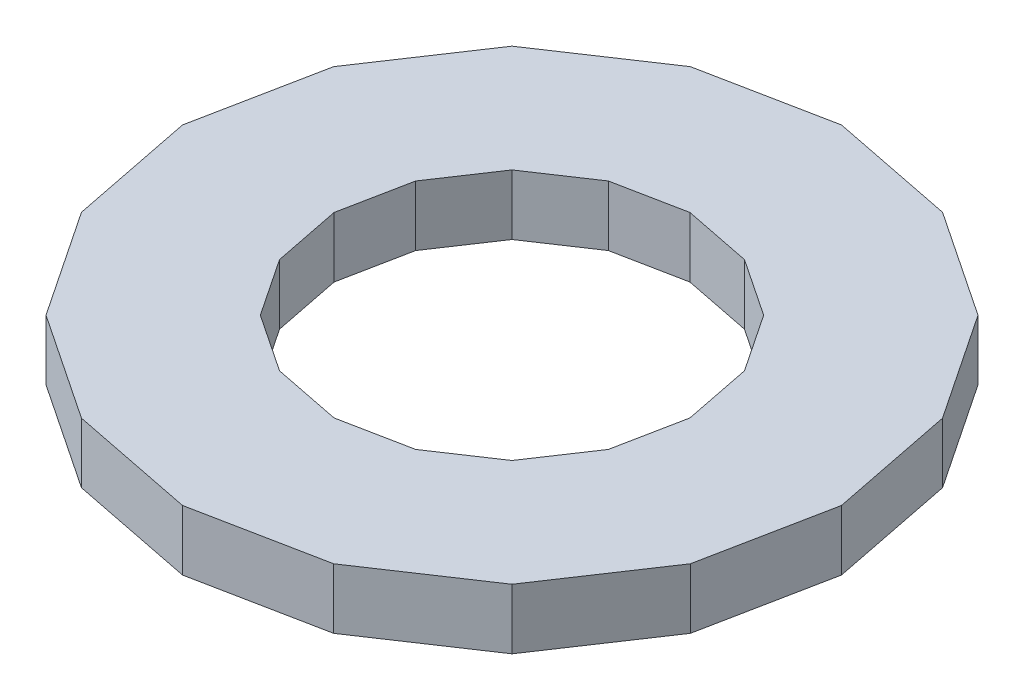
ISO-10303-21;
HEADER;
FILE_DESCRIPTION(('STEP AP214'),'2;1');
FILE_NAME('part.step','',(''),(''),'','','');
FILE_SCHEMA(('AUTOMOTIVE_DESIGN { 1 0 10303 214 1 1 1 1 }'));
ENDSEC;
DATA;
#1=APPLICATION_CONTEXT('core data for automotive mechanical design processes');
#2=APPLICATION_PROTOCOL_DEFINITION('international standard','automotive_design',2000,#1);
#3=PRODUCT_CONTEXT('',#1,'mechanical');
#4=PRODUCT('Part','Part','',(#3));
#5=PRODUCT_RELATED_PRODUCT_CATEGORY('part','',(#4));
#6=PRODUCT_DEFINITION_FORMATION('','',#4);
#7=PRODUCT_DEFINITION_CONTEXT('part definition',#1,'design');
#8=PRODUCT_DEFINITION('design','',#6,#7);
#9=PRODUCT_DEFINITION_SHAPE('','',#8);
#10=(LENGTH_UNIT() NAMED_UNIT(*) SI_UNIT(.MILLI.,.METRE.));
#11=(NAMED_UNIT(*) PLANE_ANGLE_UNIT() SI_UNIT($,.RADIAN.));
#12=(NAMED_UNIT(*) SI_UNIT($,.STERADIAN.) SOLID_ANGLE_UNIT());
#13=UNCERTAINTY_MEASURE_WITH_UNIT(LENGTH_MEASURE(1.E-05),#10,'distance_accuracy_value','');
#14=(GEOMETRIC_REPRESENTATION_CONTEXT(3) GLOBAL_UNCERTAINTY_ASSIGNED_CONTEXT((#13)) GLOBAL_UNIT_ASSIGNED_CONTEXT((#10,
#11,#12)) REPRESENTATION_CONTEXT('',''));
#15=CARTESIAN_POINT('',(0.,0.,0.));
#16=DIRECTION('',(0.,0.,1.));
#17=DIRECTION('',(1.,0.,0.));
#18=AXIS2_PLACEMENT_3D('',#15,#16,#17);
#19=CARTESIAN_POINT('',(0.,19.05,0.));
#20=DIRECTION('',(0.,1.,0.));
#21=DIRECTION('',(0.,0.,1.));
#22=AXIS2_PLACEMENT_3D('',#19,#20,#21);
#23=PLANE('',#22);
#24=DIRECTION('',(0.195090322016117,0.,-0.980785280403233));
#25=VECTOR('',#24,1.);
#26=CARTESIAN_POINT('',(96.2284131094798,19.05,39.8591137955862));
#27=LINE('',#26,#25);
#28=CARTESIAN_POINT('',(96.2284131094798,19.05,39.8591137955862));
#29=VERTEX_POINT('',#28);
#30=CARTESIAN_POINT('',(104.156883796215,19.05,-1.13797643195644E-12));
#31=VERTEX_POINT('',#30);
#32=EDGE_CURVE('E370',#29,#31,#27,.T.);
#33=ORIENTED_EDGE('',*,*,#32,.T.);
#34=DIRECTION('',(-0.195090322016139,0.,-0.980785280403228));
#35=VECTOR('',#34,1.);
#36=CARTESIAN_POINT('',(104.156883796215,19.05,-1.13797643195644E-12));
#37=LINE('',#36,#35);
#38=CARTESIAN_POINT('',(96.2284131094789,19.05,-39.8591137955883));
#39=VERTEX_POINT('',#38);
#40=EDGE_CURVE('E373',#31,#39,#37,.T.);
#41=ORIENTED_EDGE('',*,*,#40,.T.);
#42=DIRECTION('',(-0.555570233019612,0.,-0.831469612302539));
#43=VECTOR('',#42,1.);
#44=CARTESIAN_POINT('',(96.2284131094789,19.05,-39.8591137955883));
#45=LINE('',#44,#43);
#46=CARTESIAN_POINT('',(73.6500388395619,19.05,-73.6500388395636));
#47=VERTEX_POINT('',#46);
#48=EDGE_CURVE('E376',#39,#47,#45,.T.);
#49=ORIENTED_EDGE('',*,*,#48,.T.);
#50=DIRECTION('',(-0.831469612302551,0.,-0.555570233019593));
#51=VECTOR('',#50,1.);
#52=CARTESIAN_POINT('',(73.6500388395619,19.05,-73.6500388395636));
#53=LINE('',#52,#51);
#54=CARTESIAN_POINT('',(39.8591137955863,19.05,-96.2284131094797));
#55=VERTEX_POINT('',#54);
#56=EDGE_CURVE('E379',#47,#55,#53,.T.);
#57=ORIENTED_EDGE('',*,*,#56,.T.);
#58=DIRECTION('',(-0.980785280403233,0.,-0.195090322016117));
#59=VECTOR('',#58,1.);
#60=CARTESIAN_POINT('',(39.8591137955863,19.05,-96.2284131094797));
#61=LINE('',#60,#59);
#62=CARTESIAN_POINT('',(-1.12392690365503E-12,19.05,-104.156883796215));
#63=VERTEX_POINT('',#62);
#64=EDGE_CURVE('E381',#55,#63,#61,.T.);
#65=ORIENTED_EDGE('',*,*,#64,.T.);
#66=DIRECTION('',(-0.980785280403228,0.,0.195090322016139));
#67=VECTOR('',#66,1.);
#68=CARTESIAN_POINT('',(-1.12392690365503E-12,19.05,-104.156883796215));
#69=LINE('',#68,#67);
#70=CARTESIAN_POINT('',(-39.8591137955883,19.05,-96.2284131094789));
#71=VERTEX_POINT('',#70);
#72=EDGE_CURVE('E383',#63,#71,#69,.T.);
#73=ORIENTED_EDGE('',*,*,#72,.T.);
#74=DIRECTION('',(-0.831469612302539,0.,0.555570233019612));
#75=VECTOR('',#74,1.);
#76=CARTESIAN_POINT('',(-39.8591137955883,19.05,-96.2284131094789));
#77=LINE('',#76,#75);
#78=CARTESIAN_POINT('',(-73.6500388395635,19.05,-73.6500388395619));
#79=VERTEX_POINT('',#78);
#80=EDGE_CURVE('E385',#71,#79,#77,.T.);
#81=ORIENTED_EDGE('',*,*,#80,.T.);
#82=DIRECTION('',(-0.555570233019593,0.,0.831469612302552));
#83=VECTOR('',#82,1.);
#84=CARTESIAN_POINT('',(-73.6500388395635,19.05,-73.6500388395619));
#85=LINE('',#84,#83);
#86=CARTESIAN_POINT('',(-96.2284131094798,19.05,-39.8591137955861));
#87=VERTEX_POINT('',#86);
#88=EDGE_CURVE('E387',#79,#87,#85,.T.);
#89=ORIENTED_EDGE('',*,*,#88,.T.);
#90=DIRECTION('',(-0.195090322016118,0.,0.980785280403233));
#91=VECTOR('',#90,1.);
#92=CARTESIAN_POINT('',(-96.2284131094798,19.05,-39.8591137955861));
#93=LINE('',#92,#91);
#94=CARTESIAN_POINT('',(-104.156883796215,19.05,1.17280698412532E-12));
#95=VERTEX_POINT('',#94);
#96=EDGE_CURVE('E389',#87,#95,#93,.T.);
#97=ORIENTED_EDGE('',*,*,#96,.T.);
#98=DIRECTION('',(0.195090322016139,0.,0.980785280403228));
#99=VECTOR('',#98,1.);
#100=CARTESIAN_POINT('',(-104.156883796215,19.05,1.17280698412532E-12));
#101=LINE('',#100,#99);
#102=CARTESIAN_POINT('',(-96.2284131094789,19.05,39.8591137955883));
#103=VERTEX_POINT('',#102);
#104=EDGE_CURVE('E391',#95,#103,#101,.T.);
#105=ORIENTED_EDGE('',*,*,#104,.T.);
#106=DIRECTION('',(0.555570233019611,0.,0.831469612302539));
#107=VECTOR('',#106,1.);
#108=CARTESIAN_POINT('',(-96.2284131094789,19.05,39.8591137955883));
#109=LINE('',#108,#107);
#110=CARTESIAN_POINT('',(-73.6500388395619,19.05,73.6500388395635));
#111=VERTEX_POINT('',#110);
#112=EDGE_CURVE('E393',#103,#111,#109,.T.);
#113=ORIENTED_EDGE('',*,*,#112,.T.);
#114=DIRECTION('',(0.831469612302552,0.,0.555570233019593));
#115=VECTOR('',#114,1.);
#116=CARTESIAN_POINT('',(-73.6500388395619,19.05,73.6500388395635));
#117=LINE('',#116,#115);
#118=CARTESIAN_POINT('',(-39.8591137955862,19.05,96.2284131094798));
#119=VERTEX_POINT('',#118);
#120=EDGE_CURVE('E395',#111,#119,#117,.T.);
#121=ORIENTED_EDGE('',*,*,#120,.T.);
#122=DIRECTION('',(0.980785280403233,0.,0.195090322016118));
#123=VECTOR('',#122,1.);
#124=CARTESIAN_POINT('',(-39.8591137955862,19.05,96.2284131094798));
#125=LINE('',#124,#123);
#126=CARTESIAN_POINT('',(1.1188155577576E-12,19.05,104.156883796215));
#127=VERTEX_POINT('',#126);
#128=EDGE_CURVE('E397',#119,#127,#125,.T.);
#129=ORIENTED_EDGE('',*,*,#128,.T.);
#130=DIRECTION('',(0.980785280403228,0.,-0.195090322016139));
#131=VECTOR('',#130,1.);
#132=CARTESIAN_POINT('',(1.1188155577576E-12,19.05,104.156883796215));
#133=LINE('',#132,#131);
#134=CARTESIAN_POINT('',(39.8591137955884,19.05,96.2284131094789));
#135=VERTEX_POINT('',#134);
#136=EDGE_CURVE('E399',#127,#135,#133,.T.);
#137=ORIENTED_EDGE('',*,*,#136,.T.);
#138=DIRECTION('',(0.831469612302539,0.,-0.555570233019612));
#139=VECTOR('',#138,1.);
#140=CARTESIAN_POINT('',(39.8591137955884,19.05,96.2284131094789));
#141=LINE('',#140,#139);
#142=CARTESIAN_POINT('',(73.6500388395635,19.05,73.6500388395619));
#143=VERTEX_POINT('',#142);
#144=EDGE_CURVE('E401',#135,#143,#141,.T.);
#145=ORIENTED_EDGE('',*,*,#144,.T.);
#146=DIRECTION('',(0.555570233019593,0.,-0.831469612302551));
#147=VECTOR('',#146,1.);
#148=CARTESIAN_POINT('',(73.6500388395635,19.05,73.6500388395619));
#149=LINE('',#148,#147);
#150=EDGE_CURVE('E403',#143,#29,#149,.T.);
#151=ORIENTED_EDGE('',*,*,#150,.T.);
#152=EDGE_LOOP('',(#33,#41,#49,#57,#65,#73,#81,#89,#97,#105,#113,#121,#129,#137,#145,#151));
#153=FACE_BOUND('',#152,.T.);
#154=DIRECTION('',(-0.195090322016139,0.,-0.980785280403228));
#155=VECTOR('',#154,1.);
#156=CARTESIAN_POINT('',(56.2462952720059,19.05,-6.4166277362856E-13));
#157=LINE('',#156,#155);
#158=CARTESIAN_POINT('',(56.2462952720059,19.05,-6.4166277362856E-13));
#159=VERTEX_POINT('',#158);
#160=CARTESIAN_POINT('',(51.9648009813924,19.05,-21.5245253325121));
#161=VERTEX_POINT('',#160);
#162=EDGE_CURVE('E252',#159,#161,#157,.T.);
#163=ORIENTED_EDGE('',*,*,#162,.F.);
#164=DIRECTION('',(0.195090322016117,0.,-0.980785280403233));
#165=VECTOR('',#164,1.);
#166=CARTESIAN_POINT('',(51.9648009813929,19.05,21.524525332511));
#167=LINE('',#166,#165);
#168=CARTESIAN_POINT('',(51.9648009813929,19.05,21.524525332511));
#169=VERTEX_POINT('',#168);
#170=EDGE_CURVE('E244',#169,#159,#167,.T.);
#171=ORIENTED_EDGE('',*,*,#170,.F.);
#172=DIRECTION('',(0.555570233019593,0.,-0.831469612302552));
#173=VECTOR('',#172,1.);
#174=CARTESIAN_POINT('',(39.7721368034567,19.05,39.7721368034558));
#175=LINE('',#174,#173);
#176=CARTESIAN_POINT('',(39.7721368034567,19.05,39.7721368034558));
#177=VERTEX_POINT('',#176);
#178=EDGE_CURVE('E297',#177,#169,#175,.T.);
#179=ORIENTED_EDGE('',*,*,#178,.F.);
#180=DIRECTION('',(0.831469612302539,0.,-0.555570233019611));
#181=VECTOR('',#180,1.);
#182=CARTESIAN_POINT('',(21.5245253325122,19.05,51.9648009813924));
#183=LINE('',#182,#181);
#184=CARTESIAN_POINT('',(21.5245253325122,19.05,51.9648009813924));
#185=VERTEX_POINT('',#184);
#186=EDGE_CURVE('E295',#185,#177,#183,.T.);
#187=ORIENTED_EDGE('',*,*,#186,.F.);
#188=DIRECTION('',(0.980785280403228,0.,-0.195090322016139));
#189=VECTOR('',#188,1.);
#190=CARTESIAN_POINT('',(6.52791289658775E-13,19.05,56.2462952720059));
#191=LINE('',#190,#189);
#192=CARTESIAN_POINT('',(6.52791289658775E-13,19.05,56.2462952720059));
#193=VERTEX_POINT('',#192);
#194=EDGE_CURVE('E293',#193,#185,#191,.T.);
#195=ORIENTED_EDGE('',*,*,#194,.F.);
#196=DIRECTION('',(0.980785280403233,0.,0.195090322016118));
#197=VECTOR('',#196,1.);
#198=CARTESIAN_POINT('',(-21.5245253325109,19.05,51.9648009813929));
#199=LINE('',#198,#197);
#200=CARTESIAN_POINT('',(-21.5245253325109,19.05,51.9648009813929));
#201=VERTEX_POINT('',#200);
#202=EDGE_CURVE('E291',#201,#193,#199,.T.);
#203=ORIENTED_EDGE('',*,*,#202,.F.);
#204=DIRECTION('',(0.831469612302551,0.,0.555570233019593));
#205=VECTOR('',#204,1.);
#206=CARTESIAN_POINT('',(-39.7721368034558,19.05,39.7721368034567));
#207=LINE('',#206,#205);
#208=CARTESIAN_POINT('',(-39.7721368034558,19.05,39.7721368034567));
#209=VERTEX_POINT('',#208);
#210=EDGE_CURVE('E289',#209,#201,#207,.T.);
#211=ORIENTED_EDGE('',*,*,#210,.F.);
#212=DIRECTION('',(0.555570233019611,0.,0.831469612302539));
#213=VECTOR('',#212,1.);
#214=CARTESIAN_POINT('',(-51.9648009813924,19.05,21.5245253325121));
#215=LINE('',#214,#213);
#216=CARTESIAN_POINT('',(-51.9648009813924,19.05,21.5245253325121));
#217=VERTEX_POINT('',#216);
#218=EDGE_CURVE('E287',#217,#209,#215,.T.);
#219=ORIENTED_EDGE('',*,*,#218,.F.);
#220=DIRECTION('',(0.195090322016139,0.,0.980785280403228));
#221=VECTOR('',#220,1.);
#222=CARTESIAN_POINT('',(-56.2462952720059,19.05,6.347391871939E-13));
#223=LINE('',#222,#221);
#224=CARTESIAN_POINT('',(-56.2462952720059,19.05,6.347391871939E-13));
#225=VERTEX_POINT('',#224);
#226=EDGE_CURVE('E285',#225,#217,#223,.T.);
#227=ORIENTED_EDGE('',*,*,#226,.F.);
#228=DIRECTION('',(-0.195090322016117,0.,0.980785280403233));
#229=VECTOR('',#228,1.);
#230=CARTESIAN_POINT('',(-51.9648009813928,19.05,-21.5245253325109));
#231=LINE('',#230,#229);
#232=CARTESIAN_POINT('',(-51.9648009813928,19.05,-21.5245253325109));
#233=VERTEX_POINT('',#232);
#234=EDGE_CURVE('E283',#233,#225,#231,.T.);
#235=ORIENTED_EDGE('',*,*,#234,.F.);
#236=DIRECTION('',(-0.555570233019593,0.,0.831469612302552));
#237=VECTOR('',#236,1.);
#238=CARTESIAN_POINT('',(-39.7721368034567,19.05,-39.7721368034558));
#239=LINE('',#238,#237);
#240=CARTESIAN_POINT('',(-39.7721368034567,19.05,-39.7721368034558));
#241=VERTEX_POINT('',#240);
#242=EDGE_CURVE('E281',#241,#233,#239,.T.);
#243=ORIENTED_EDGE('',*,*,#242,.F.);
#244=DIRECTION('',(-0.831469612302539,0.,0.555570233019612));
#245=VECTOR('',#244,1.);
#246=CARTESIAN_POINT('',(-21.5245253325121,19.05,-51.9648009813924));
#247=LINE('',#246,#245);
#248=CARTESIAN_POINT('',(-21.5245253325121,19.05,-51.9648009813924));
#249=VERTEX_POINT('',#248);
#250=EDGE_CURVE('E279',#249,#241,#247,.T.);
#251=ORIENTED_EDGE('',*,*,#250,.F.);
#252=DIRECTION('',(-0.980785280403228,0.,0.195090322016139));
#253=VECTOR('',#252,1.);
#254=CARTESIAN_POINT('',(-6.62740420630265E-13,19.05,-56.2462952720059));
#255=LINE('',#254,#253);
#256=CARTESIAN_POINT('',(-6.62740420630265E-13,19.05,-56.2462952720059));
#257=VERTEX_POINT('',#256);
#258=EDGE_CURVE('E277',#257,#249,#255,.T.);
#259=ORIENTED_EDGE('',*,*,#258,.F.);
#260=DIRECTION('',(-0.980785280403233,0.,-0.195090322016117));
#261=VECTOR('',#260,1.);
#262=CARTESIAN_POINT('',(21.5245253325111,19.05,-51.9648009813928));
#263=LINE('',#262,#261);
#264=CARTESIAN_POINT('',(21.5245253325111,19.05,-51.9648009813928));
#265=VERTEX_POINT('',#264);
#266=EDGE_CURVE('E275',#265,#257,#263,.T.);
#267=ORIENTED_EDGE('',*,*,#266,.F.);
#268=DIRECTION('',(-0.831469612302552,0.,-0.555570233019593));
#269=VECTOR('',#268,1.);
#270=CARTESIAN_POINT('',(39.7721368034558,19.05,-39.7721368034567));
#271=LINE('',#270,#269);
#272=CARTESIAN_POINT('',(39.7721368034558,19.05,-39.7721368034567));
#273=VERTEX_POINT('',#272);
#274=EDGE_CURVE('E271',#273,#265,#271,.T.);
#275=ORIENTED_EDGE('',*,*,#274,.F.);
#276=DIRECTION('',(-0.555570233019612,0.,-0.831469612302539));
#277=VECTOR('',#276,1.);
#278=CARTESIAN_POINT('',(51.9648009813924,19.05,-21.5245253325121));
#279=LINE('',#278,#277);
#280=EDGE_CURVE('E265',#161,#273,#279,.T.);
#281=ORIENTED_EDGE('',*,*,#280,.F.);
#282=EDGE_LOOP('',(#163,#171,#179,#187,#195,#203,#211,#219,#227,#235,#243,#251,#259,#267,#275,#281));
#283=FACE_BOUND('',#282,.T.);
#284=ADVANCED_FACE('F35',(#153,#283),#23,.T.);
#285=CARTESIAN_POINT('',(0.,0.,0.));
#286=DIRECTION('',(0.,1.,0.));
#287=DIRECTION('',(0.,0.,1.));
#288=AXIS2_PLACEMENT_3D('',#285,#286,#287);
#289=PLANE('',#288);
#290=DIRECTION('',(0.195090322016117,0.,-0.980785280403233));
#291=VECTOR('',#290,1.);
#292=CARTESIAN_POINT('',(96.2284131094798,0.,39.8591137955862));
#293=LINE('',#292,#291);
#294=CARTESIAN_POINT('',(96.2284131094798,0.,39.8591137955862));
#295=VERTEX_POINT('',#294);
#296=CARTESIAN_POINT('',(104.156883796215,0.,-1.13797643195644E-12));
#297=VERTEX_POINT('',#296);
#298=EDGE_CURVE('E260',#295,#297,#293,.T.);
#299=ORIENTED_EDGE('',*,*,#298,.F.);
#300=DIRECTION('',(0.555570233019593,0.,-0.831469612302551));
#301=VECTOR('',#300,1.);
#302=CARTESIAN_POINT('',(73.6500388395635,0.,73.6500388395619));
#303=LINE('',#302,#301);
#304=CARTESIAN_POINT('',(73.6500388395635,0.,73.6500388395619));
#305=VERTEX_POINT('',#304);
#306=EDGE_CURVE('E374',#305,#295,#303,.T.);
#307=ORIENTED_EDGE('',*,*,#306,.F.);
#308=DIRECTION('',(0.831469612302539,0.,-0.555570233019612));
#309=VECTOR('',#308,1.);
#310=CARTESIAN_POINT('',(39.8591137955884,0.,96.2284131094789));
#311=LINE('',#310,#309);
#312=CARTESIAN_POINT('',(39.8591137955884,0.,96.2284131094789));
#313=VERTEX_POINT('',#312);
#314=EDGE_CURVE('E435',#313,#305,#311,.T.);
#315=ORIENTED_EDGE('',*,*,#314,.F.);
#316=DIRECTION('',(0.980785280403228,0.,-0.195090322016139));
#317=VECTOR('',#316,1.);
#318=CARTESIAN_POINT('',(1.1188155577576E-12,0.,104.156883796215));
#319=LINE('',#318,#317);
#320=CARTESIAN_POINT('',(1.1188155577576E-12,0.,104.156883796215));
#321=VERTEX_POINT('',#320);
#322=EDGE_CURVE('E433',#321,#313,#319,.T.);
#323=ORIENTED_EDGE('',*,*,#322,.F.);
#324=DIRECTION('',(0.980785280403233,0.,0.195090322016118));
#325=VECTOR('',#324,1.);
#326=CARTESIAN_POINT('',(-39.8591137955862,0.,96.2284131094798));
#327=LINE('',#326,#325);
#328=CARTESIAN_POINT('',(-39.8591137955862,0.,96.2284131094798));
#329=VERTEX_POINT('',#328);
#330=EDGE_CURVE('E431',#329,#321,#327,.T.);
#331=ORIENTED_EDGE('',*,*,#330,.F.);
#332=DIRECTION('',(0.831469612302552,0.,0.555570233019593));
#333=VECTOR('',#332,1.);
#334=CARTESIAN_POINT('',(-73.6500388395619,0.,73.6500388395635));
#335=LINE('',#334,#333);
#336=CARTESIAN_POINT('',(-73.6500388395619,0.,73.6500388395635));
#337=VERTEX_POINT('',#336);
#338=EDGE_CURVE('E429',#337,#329,#335,.T.);
#339=ORIENTED_EDGE('',*,*,#338,.F.);
#340=DIRECTION('',(0.555570233019611,0.,0.831469612302539));
#341=VECTOR('',#340,1.);
#342=CARTESIAN_POINT('',(-96.2284131094789,0.,39.8591137955883));
#343=LINE('',#342,#341);
#344=CARTESIAN_POINT('',(-96.2284131094789,0.,39.8591137955883));
#345=VERTEX_POINT('',#344);
#346=EDGE_CURVE('E427',#345,#337,#343,.T.);
#347=ORIENTED_EDGE('',*,*,#346,.F.);
#348=DIRECTION('',(0.195090322016139,0.,0.980785280403228));
#349=VECTOR('',#348,1.);
#350=CARTESIAN_POINT('',(-104.156883796215,0.,1.17280698412532E-12));
#351=LINE('',#350,#349);
#352=CARTESIAN_POINT('',(-104.156883796215,0.,1.17280698412532E-12));
#353=VERTEX_POINT('',#352);
#354=EDGE_CURVE('E425',#353,#345,#351,.T.);
#355=ORIENTED_EDGE('',*,*,#354,.F.);
#356=DIRECTION('',(-0.195090322016118,0.,0.980785280403233));
#357=VECTOR('',#356,1.);
#358=CARTESIAN_POINT('',(-96.2284131094798,0.,-39.8591137955861));
#359=LINE('',#358,#357);
#360=CARTESIAN_POINT('',(-96.2284131094798,0.,-39.8591137955861));
#361=VERTEX_POINT('',#360);
#362=EDGE_CURVE('E423',#361,#353,#359,.T.);
#363=ORIENTED_EDGE('',*,*,#362,.F.);
#364=DIRECTION('',(-0.555570233019593,0.,0.831469612302552));
#365=VECTOR('',#364,1.);
#366=CARTESIAN_POINT('',(-73.6500388395635,0.,-73.6500388395619));
#367=LINE('',#366,#365);
#368=CARTESIAN_POINT('',(-73.6500388395635,0.,-73.6500388395619));
#369=VERTEX_POINT('',#368);
#370=EDGE_CURVE('E421',#369,#361,#367,.T.);
#371=ORIENTED_EDGE('',*,*,#370,.F.);
#372=DIRECTION('',(-0.831469612302539,0.,0.555570233019612));
#373=VECTOR('',#372,1.);
#374=CARTESIAN_POINT('',(-39.8591137955883,0.,-96.2284131094789));
#375=LINE('',#374,#373);
#376=CARTESIAN_POINT('',(-39.8591137955883,0.,-96.2284131094789));
#377=VERTEX_POINT('',#376);
#378=EDGE_CURVE('E419',#377,#369,#375,.T.);
#379=ORIENTED_EDGE('',*,*,#378,.F.);
#380=DIRECTION('',(-0.980785280403228,0.,0.195090322016139));
#381=VECTOR('',#380,1.);
#382=CARTESIAN_POINT('',(-1.12392690365503E-12,0.,-104.156883796215));
#383=LINE('',#382,#381);
#384=CARTESIAN_POINT('',(-1.12392690365503E-12,0.,-104.156883796215));
#385=VERTEX_POINT('',#384);
#386=EDGE_CURVE('E417',#385,#377,#383,.T.);
#387=ORIENTED_EDGE('',*,*,#386,.F.);
#388=DIRECTION('',(-0.980785280403233,0.,-0.195090322016117));
#389=VECTOR('',#388,1.);
#390=CARTESIAN_POINT('',(39.8591137955863,0.,-96.2284131094797));
#391=LINE('',#390,#389);
#392=CARTESIAN_POINT('',(39.8591137955863,0.,-96.2284131094797));
#393=VERTEX_POINT('',#392);
#394=EDGE_CURVE('E415',#393,#385,#391,.T.);
#395=ORIENTED_EDGE('',*,*,#394,.F.);
#396=DIRECTION('',(-0.831469612302551,0.,-0.555570233019593));
#397=VECTOR('',#396,1.);
#398=CARTESIAN_POINT('',(73.6500388395619,0.,-73.6500388395636));
#399=LINE('',#398,#397);
#400=CARTESIAN_POINT('',(73.6500388395619,0.,-73.6500388395636));
#401=VERTEX_POINT('',#400);
#402=EDGE_CURVE('E413',#401,#393,#399,.T.);
#403=ORIENTED_EDGE('',*,*,#402,.F.);
#404=DIRECTION('',(-0.555570233019612,0.,-0.831469612302539));
#405=VECTOR('',#404,1.);
#406=CARTESIAN_POINT('',(96.2284131094789,0.,-39.8591137955883));
#407=LINE('',#406,#405);
#408=CARTESIAN_POINT('',(96.2284131094789,0.,-39.8591137955883));
#409=VERTEX_POINT('',#408);
#410=EDGE_CURVE('E410',#409,#401,#407,.T.);
#411=ORIENTED_EDGE('',*,*,#410,.F.);
#412=DIRECTION('',(-0.195090322016139,0.,-0.980785280403228));
#413=VECTOR('',#412,1.);
#414=CARTESIAN_POINT('',(104.156883796215,0.,-1.13797643195644E-12));
#415=LINE('',#414,#413);
#416=EDGE_CURVE('E408',#297,#409,#415,.T.);
#417=ORIENTED_EDGE('',*,*,#416,.F.);
#418=EDGE_LOOP('',(#299,#307,#315,#323,#331,#339,#347,#355,#363,#371,#379,#387,#395,#403,#411,#417));
#419=FACE_BOUND('',#418,.T.);
#420=DIRECTION('',(0.195090322016117,0.,-0.980785280403233));
#421=VECTOR('',#420,1.);
#422=CARTESIAN_POINT('',(51.9648009813929,0.,21.524525332511));
#423=LINE('',#422,#421);
#424=CARTESIAN_POINT('',(51.9648009813929,0.,21.524525332511));
#425=VERTEX_POINT('',#424);
#426=CARTESIAN_POINT('',(56.2462952720059,0.,-6.4166277362856E-13));
#427=VERTEX_POINT('',#426);
#428=EDGE_CURVE('E58',#425,#427,#423,.T.);
#429=ORIENTED_EDGE('',*,*,#428,.T.);
#430=DIRECTION('',(-0.195090322016139,0.,-0.980785280403228));
#431=VECTOR('',#430,1.);
#432=CARTESIAN_POINT('',(56.2462952720059,0.,-6.4166277362856E-13));
#433=LINE('',#432,#431);
#434=CARTESIAN_POINT('',(51.9648009813924,0.,-21.5245253325121));
#435=VERTEX_POINT('',#434);
#436=EDGE_CURVE('E259',#427,#435,#433,.T.);
#437=ORIENTED_EDGE('',*,*,#436,.T.);
#438=DIRECTION('',(-0.555570233019612,0.,-0.831469612302539));
#439=VECTOR('',#438,1.);
#440=CARTESIAN_POINT('',(51.9648009813924,0.,-21.5245253325121));
#441=LINE('',#440,#439);
#442=CARTESIAN_POINT('',(39.7721368034558,0.,-39.7721368034567));
#443=VERTEX_POINT('',#442);
#444=EDGE_CURVE('E301',#435,#443,#441,.T.);
#445=ORIENTED_EDGE('',*,*,#444,.T.);
#446=DIRECTION('',(-0.831469612302552,0.,-0.555570233019593));
#447=VECTOR('',#446,1.);
#448=CARTESIAN_POINT('',(39.7721368034558,0.,-39.7721368034567));
#449=LINE('',#448,#447);
#450=CARTESIAN_POINT('',(21.5245253325111,0.,-51.9648009813928));
#451=VERTEX_POINT('',#450);
#452=EDGE_CURVE('E304',#443,#451,#449,.T.);
#453=ORIENTED_EDGE('',*,*,#452,.T.);
#454=DIRECTION('',(-0.980785280403233,0.,-0.195090322016117));
#455=VECTOR('',#454,1.);
#456=CARTESIAN_POINT('',(21.5245253325111,0.,-51.9648009813928));
#457=LINE('',#456,#455);
#458=CARTESIAN_POINT('',(-6.62740420630265E-13,0.,-56.2462952720059));
#459=VERTEX_POINT('',#458);
#460=EDGE_CURVE('E307',#451,#459,#457,.T.);
#461=ORIENTED_EDGE('',*,*,#460,.T.);
#462=DIRECTION('',(-0.980785280403228,0.,0.195090322016139));
#463=VECTOR('',#462,1.);
#464=CARTESIAN_POINT('',(-6.62740420630265E-13,0.,-56.2462952720059));
#465=LINE('',#464,#463);
#466=CARTESIAN_POINT('',(-21.5245253325121,0.,-51.9648009813924));
#467=VERTEX_POINT('',#466);
#468=EDGE_CURVE('E310',#459,#467,#465,.T.);
#469=ORIENTED_EDGE('',*,*,#468,.T.);
#470=DIRECTION('',(-0.831469612302539,0.,0.555570233019612));
#471=VECTOR('',#470,1.);
#472=CARTESIAN_POINT('',(-21.5245253325121,0.,-51.9648009813924));
#473=LINE('',#472,#471);
#474=CARTESIAN_POINT('',(-39.7721368034567,0.,-39.7721368034558));
#475=VERTEX_POINT('',#474);
#476=EDGE_CURVE('E313',#467,#475,#473,.T.);
#477=ORIENTED_EDGE('',*,*,#476,.T.);
#478=DIRECTION('',(-0.555570233019593,0.,0.831469612302552));
#479=VECTOR('',#478,1.);
#480=CARTESIAN_POINT('',(-39.7721368034567,0.,-39.7721368034558));
#481=LINE('',#480,#479);
#482=CARTESIAN_POINT('',(-51.9648009813928,0.,-21.5245253325109));
#483=VERTEX_POINT('',#482);
#484=EDGE_CURVE('E316',#475,#483,#481,.T.);
#485=ORIENTED_EDGE('',*,*,#484,.T.);
#486=DIRECTION('',(-0.195090322016117,0.,0.980785280403233));
#487=VECTOR('',#486,1.);
#488=CARTESIAN_POINT('',(-51.9648009813928,0.,-21.5245253325109));
#489=LINE('',#488,#487);
#490=CARTESIAN_POINT('',(-56.2462952720059,0.,6.347391871939E-13));
#491=VERTEX_POINT('',#490);
#492=EDGE_CURVE('E319',#483,#491,#489,.T.);
#493=ORIENTED_EDGE('',*,*,#492,.T.);
#494=DIRECTION('',(0.195090322016139,0.,0.980785280403228));
#495=VECTOR('',#494,1.);
#496=CARTESIAN_POINT('',(-56.2462952720059,0.,6.347391871939E-13));
#497=LINE('',#496,#495);
#498=CARTESIAN_POINT('',(-51.9648009813924,0.,21.5245253325121));
#499=VERTEX_POINT('',#498);
#500=EDGE_CURVE('E322',#491,#499,#497,.T.);
#501=ORIENTED_EDGE('',*,*,#500,.T.);
#502=DIRECTION('',(0.555570233019611,0.,0.831469612302539));
#503=VECTOR('',#502,1.);
#504=CARTESIAN_POINT('',(-51.9648009813924,0.,21.5245253325121));
#505=LINE('',#504,#503);
#506=CARTESIAN_POINT('',(-39.7721368034558,0.,39.7721368034567));
#507=VERTEX_POINT('',#506);
#508=EDGE_CURVE('E325',#499,#507,#505,.T.);
#509=ORIENTED_EDGE('',*,*,#508,.T.);
#510=DIRECTION('',(0.831469612302551,0.,0.555570233019593));
#511=VECTOR('',#510,1.);
#512=CARTESIAN_POINT('',(-39.7721368034558,0.,39.7721368034567));
#513=LINE('',#512,#511);
#514=CARTESIAN_POINT('',(-21.5245253325109,0.,51.9648009813929));
#515=VERTEX_POINT('',#514);
#516=EDGE_CURVE('E328',#507,#515,#513,.T.);
#517=ORIENTED_EDGE('',*,*,#516,.T.);
#518=DIRECTION('',(0.980785280403233,0.,0.195090322016118));
#519=VECTOR('',#518,1.);
#520=CARTESIAN_POINT('',(-21.5245253325109,0.,51.9648009813929));
#521=LINE('',#520,#519);
#522=CARTESIAN_POINT('',(6.52791289658775E-13,0.,56.2462952720059));
#523=VERTEX_POINT('',#522);
#524=EDGE_CURVE('E331',#515,#523,#521,.T.);
#525=ORIENTED_EDGE('',*,*,#524,.T.);
#526=DIRECTION('',(0.980785280403228,0.,-0.195090322016139));
#527=VECTOR('',#526,1.);
#528=CARTESIAN_POINT('',(6.52791289658775E-13,0.,56.2462952720059));
#529=LINE('',#528,#527);
#530=CARTESIAN_POINT('',(21.5245253325122,0.,51.9648009813924));
#531=VERTEX_POINT('',#530);
#532=EDGE_CURVE('E334',#523,#531,#529,.T.);
#533=ORIENTED_EDGE('',*,*,#532,.T.);
#534=DIRECTION('',(0.831469612302539,0.,-0.555570233019611));
#535=VECTOR('',#534,1.);
#536=CARTESIAN_POINT('',(21.5245253325122,0.,51.9648009813924));
#537=LINE('',#536,#535);
#538=CARTESIAN_POINT('',(39.7721368034567,0.,39.7721368034558));
#539=VERTEX_POINT('',#538);
#540=EDGE_CURVE('E337',#531,#539,#537,.T.);
#541=ORIENTED_EDGE('',*,*,#540,.T.);
#542=DIRECTION('',(0.555570233019593,0.,-0.831469612302552));
#543=VECTOR('',#542,1.);
#544=CARTESIAN_POINT('',(39.7721368034567,0.,39.7721368034558));
#545=LINE('',#544,#543);
#546=EDGE_CURVE('E253',#539,#425,#545,.T.);
#547=ORIENTED_EDGE('',*,*,#546,.T.);
#548=EDGE_LOOP('',(#429,#437,#445,#453,#461,#469,#477,#485,#493,#501,#509,#517,#525,#533,#541,#547));
#549=FACE_BOUND('',#548,.T.);
#550=ADVANCED_FACE('F490',(#419,#549),#289,.F.);
#551=CARTESIAN_POINT('',(96.2284131094798,19.05,39.8591137955862));
#552=DIRECTION('',(-0.980785280403233,0.,-0.195090322016117));
#553=DIRECTION('',(-0.195090322016117,0.,0.980785280403233));
#554=AXIS2_PLACEMENT_3D('',#551,#552,#553);
#555=PLANE('',#554);
#556=ORIENTED_EDGE('',*,*,#298,.T.);
#557=DIRECTION('',(0.,-1.,0.));
#558=VECTOR('',#557,1.);
#559=CARTESIAN_POINT('',(104.156883796215,19.05,-1.13797643195644E-12));
#560=LINE('',#559,#558);
#561=EDGE_CURVE('E11',#31,#297,#560,.T.);
#562=ORIENTED_EDGE('',*,*,#561,.F.);
#563=ORIENTED_EDGE('',*,*,#32,.F.);
#564=DIRECTION('',(0.,-1.,0.));
#565=VECTOR('',#564,1.);
#566=CARTESIAN_POINT('',(96.2284131094798,19.05,39.8591137955862));
#567=LINE('',#566,#565);
#568=EDGE_CURVE('E405',#29,#295,#567,.T.);
#569=ORIENTED_EDGE('',*,*,#568,.T.);
#570=EDGE_LOOP('',(#556,#562,#563,#569));
#571=FACE_BOUND('',#570,.T.);
#572=ADVANCED_FACE('F37',(#571),#555,.F.);
#573=CARTESIAN_POINT('',(104.156883796215,19.05,-1.13797643195644E-12));
#574=DIRECTION('',(-0.980785280403228,0.,0.195090322016139));
#575=DIRECTION('',(0.195090322016139,0.,0.980785280403228));
#576=AXIS2_PLACEMENT_3D('',#573,#574,#575);
#577=PLANE('',#576);
#578=ORIENTED_EDGE('',*,*,#416,.T.);
#579=DIRECTION('',(0.,-1.,0.));
#580=VECTOR('',#579,1.);
#581=CARTESIAN_POINT('',(96.2284131094789,19.05,-39.8591137955883));
#582=LINE('',#581,#580);
#583=EDGE_CURVE('E43',#39,#409,#582,.T.);
#584=ORIENTED_EDGE('',*,*,#583,.F.);
#585=ORIENTED_EDGE('',*,*,#40,.F.);
#586=ORIENTED_EDGE('',*,*,#561,.T.);
#587=EDGE_LOOP('',(#578,#584,#585,#586));
#588=FACE_BOUND('',#587,.T.);
#589=ADVANCED_FACE('F507',(#588),#577,.F.);
#590=CARTESIAN_POINT('',(96.2284131094789,19.05,-39.8591137955883));
#591=DIRECTION('',(-0.831469612302539,0.,0.555570233019611));
#592=DIRECTION('',(0.555570233019611,0.,0.831469612302539));
#593=AXIS2_PLACEMENT_3D('',#590,#591,#592);
#594=PLANE('',#593);
#595=ORIENTED_EDGE('',*,*,#410,.T.);
#596=DIRECTION('',(0.,-1.,0.));
#597=VECTOR('',#596,1.);
#598=CARTESIAN_POINT('',(73.6500388395619,19.05,-73.6500388395636));
#599=LINE('',#598,#597);
#600=EDGE_CURVE('E477',#47,#401,#599,.T.);
#601=ORIENTED_EDGE('',*,*,#600,.F.);
#602=ORIENTED_EDGE('',*,*,#48,.F.);
#603=ORIENTED_EDGE('',*,*,#583,.T.);
#604=EDGE_LOOP('',(#595,#601,#602,#603));
#605=FACE_BOUND('',#604,.T.);
#606=ADVANCED_FACE('F484',(#605),#594,.F.);
#607=CARTESIAN_POINT('',(73.6500388395619,19.05,-73.6500388395636));
#608=DIRECTION('',(-0.555570233019593,0.,0.831469612302551));
#609=DIRECTION('',(0.831469612302552,0.,0.555570233019593));
#610=AXIS2_PLACEMENT_3D('',#607,#608,#609);
#611=PLANE('',#610);
#612=ORIENTED_EDGE('',*,*,#402,.T.);
#613=DIRECTION('',(0.,-1.,0.));
#614=VECTOR('',#613,1.);
#615=CARTESIAN_POINT('',(39.8591137955863,19.05,-96.2284131094797));
#616=LINE('',#615,#614);
#617=EDGE_CURVE('E474',#55,#393,#616,.T.);
#618=ORIENTED_EDGE('',*,*,#617,.F.);
#619=ORIENTED_EDGE('',*,*,#56,.F.);
#620=ORIENTED_EDGE('',*,*,#600,.T.);
#621=EDGE_LOOP('',(#612,#618,#619,#620));
#622=FACE_BOUND('',#621,.T.);
#623=ADVANCED_FACE('F496',(#622),#611,.F.);
#624=CARTESIAN_POINT('',(39.8591137955863,19.05,-96.2284131094797));
#625=DIRECTION('',(-0.195090322016117,0.,0.980785280403233));
#626=DIRECTION('',(0.980785280403233,0.,0.195090322016117));
#627=AXIS2_PLACEMENT_3D('',#624,#625,#626);
#628=PLANE('',#627);
#629=ORIENTED_EDGE('',*,*,#394,.T.);
#630=DIRECTION('',(0.,-1.,0.));
#631=VECTOR('',#630,1.);
#632=CARTESIAN_POINT('',(-1.12392690365503E-12,19.05,-104.156883796215));
#633=LINE('',#632,#631);
#634=EDGE_CURVE('E471',#63,#385,#633,.T.);
#635=ORIENTED_EDGE('',*,*,#634,.F.);
#636=ORIENTED_EDGE('',*,*,#64,.F.);
#637=ORIENTED_EDGE('',*,*,#617,.T.);
#638=EDGE_LOOP('',(#629,#635,#636,#637));
#639=FACE_BOUND('',#638,.T.);
#640=ADVANCED_FACE('F500',(#639),#628,.F.);
#641=CARTESIAN_POINT('',(-1.12392690365503E-12,19.05,-104.156883796215));
#642=DIRECTION('',(0.195090322016139,0.,0.980785280403228));
#643=DIRECTION('',(0.980785280403229,0.,-0.195090322016139));
#644=AXIS2_PLACEMENT_3D('',#641,#642,#643);
#645=PLANE('',#644);
#646=ORIENTED_EDGE('',*,*,#386,.T.);
#647=DIRECTION('',(0.,-1.,0.));
#648=VECTOR('',#647,1.);
#649=CARTESIAN_POINT('',(-39.8591137955883,19.05,-96.2284131094789));
#650=LINE('',#649,#648);
#651=EDGE_CURVE('E468',#71,#377,#650,.T.);
#652=ORIENTED_EDGE('',*,*,#651,.F.);
#653=ORIENTED_EDGE('',*,*,#72,.F.);
#654=ORIENTED_EDGE('',*,*,#634,.T.);
#655=EDGE_LOOP('',(#646,#652,#653,#654));
#656=FACE_BOUND('',#655,.T.);
#657=ADVANCED_FACE('F560',(#656),#645,.F.);
#658=CARTESIAN_POINT('',(-39.8591137955883,19.05,-96.2284131094789));
#659=DIRECTION('',(0.555570233019612,0.,0.831469612302539));
#660=DIRECTION('',(0.831469612302539,0.,-0.555570233019612));
#661=AXIS2_PLACEMENT_3D('',#658,#659,#660);
#662=PLANE('',#661);
#663=ORIENTED_EDGE('',*,*,#378,.T.);
#664=DIRECTION('',(0.,-1.,0.));
#665=VECTOR('',#664,1.);
#666=CARTESIAN_POINT('',(-73.6500388395635,19.05,-73.6500388395619));
#667=LINE('',#666,#665);
#668=EDGE_CURVE('E465',#79,#369,#667,.T.);
#669=ORIENTED_EDGE('',*,*,#668,.F.);
#670=ORIENTED_EDGE('',*,*,#80,.F.);
#671=ORIENTED_EDGE('',*,*,#651,.T.);
#672=EDGE_LOOP('',(#663,#669,#670,#671));
#673=FACE_BOUND('',#672,.T.);
#674=ADVANCED_FACE('F557',(#673),#662,.F.);
#675=CARTESIAN_POINT('',(-73.6500388395635,19.05,-73.6500388395619));
#676=DIRECTION('',(0.831469612302551,0.,0.555570233019593));
#677=DIRECTION('',(0.555570233019593,0.,-0.831469612302552));
#678=AXIS2_PLACEMENT_3D('',#675,#676,#677);
#679=PLANE('',#678);
#680=ORIENTED_EDGE('',*,*,#370,.T.);
#681=DIRECTION('',(0.,-1.,0.));
#682=VECTOR('',#681,1.);
#683=CARTESIAN_POINT('',(-96.2284131094798,19.05,-39.8591137955861));
#684=LINE('',#683,#682);
#685=EDGE_CURVE('E462',#87,#361,#684,.T.);
#686=ORIENTED_EDGE('',*,*,#685,.F.);
#687=ORIENTED_EDGE('',*,*,#88,.F.);
#688=ORIENTED_EDGE('',*,*,#668,.T.);
#689=EDGE_LOOP('',(#680,#686,#687,#688));
#690=FACE_BOUND('',#689,.T.);
#691=ADVANCED_FACE('F553',(#690),#679,.F.);
#692=CARTESIAN_POINT('',(-96.2284131094798,19.05,-39.8591137955861));
#693=DIRECTION('',(0.980785280403233,0.,0.195090322016118));
#694=DIRECTION('',(0.195090322016118,0.,-0.980785280403233));
#695=AXIS2_PLACEMENT_3D('',#692,#693,#694);
#696=PLANE('',#695);
#697=ORIENTED_EDGE('',*,*,#362,.T.);
#698=DIRECTION('',(0.,-1.,0.));
#699=VECTOR('',#698,1.);
#700=CARTESIAN_POINT('',(-104.156883796215,19.05,1.17280698412532E-12));
#701=LINE('',#700,#699);
#702=EDGE_CURVE('E459',#95,#353,#701,.T.);
#703=ORIENTED_EDGE('',*,*,#702,.F.);
#704=ORIENTED_EDGE('',*,*,#96,.F.);
#705=ORIENTED_EDGE('',*,*,#685,.T.);
#706=EDGE_LOOP('',(#697,#703,#704,#705));
#707=FACE_BOUND('',#706,.T.);
#708=ADVANCED_FACE('F549',(#707),#696,.F.);
#709=CARTESIAN_POINT('',(-104.156883796215,19.05,1.17280698412532E-12));
#710=DIRECTION('',(0.980785280403228,0.,-0.195090322016139));
#711=DIRECTION('',(-0.195090322016139,0.,-0.980785280403228));
#712=AXIS2_PLACEMENT_3D('',#709,#710,#711);
#713=PLANE('',#712);
#714=ORIENTED_EDGE('',*,*,#354,.T.);
#715=DIRECTION('',(0.,-1.,0.));
#716=VECTOR('',#715,1.);
#717=CARTESIAN_POINT('',(-96.2284131094789,19.05,39.8591137955883));
#718=LINE('',#717,#716);
#719=EDGE_CURVE('E456',#103,#345,#718,.T.);
#720=ORIENTED_EDGE('',*,*,#719,.F.);
#721=ORIENTED_EDGE('',*,*,#104,.F.);
#722=ORIENTED_EDGE('',*,*,#702,.T.);
#723=EDGE_LOOP('',(#714,#720,#721,#722));
#724=FACE_BOUND('',#723,.T.);
#725=ADVANCED_FACE('F544',(#724),#713,.F.);
#726=CARTESIAN_POINT('',(-96.2284131094789,19.05,39.8591137955883));
#727=DIRECTION('',(0.831469612302539,0.,-0.555570233019611));
#728=DIRECTION('',(-0.555570233019611,0.,-0.831469612302539));
#729=AXIS2_PLACEMENT_3D('',#726,#727,#728);
#730=PLANE('',#729);
#731=ORIENTED_EDGE('',*,*,#346,.T.);
#732=DIRECTION('',(0.,-1.,0.));
#733=VECTOR('',#732,1.);
#734=CARTESIAN_POINT('',(-73.6500388395619,19.05,73.6500388395635));
#735=LINE('',#734,#733);
#736=EDGE_CURVE('E453',#111,#337,#735,.T.);
#737=ORIENTED_EDGE('',*,*,#736,.F.);
#738=ORIENTED_EDGE('',*,*,#112,.F.);
#739=ORIENTED_EDGE('',*,*,#719,.T.);
#740=EDGE_LOOP('',(#731,#737,#738,#739));
#741=FACE_BOUND('',#740,.T.);
#742=ADVANCED_FACE('F538',(#741),#730,.F.);
#743=CARTESIAN_POINT('',(-73.6500388395619,19.05,73.6500388395635));
#744=DIRECTION('',(0.555570233019593,0.,-0.831469612302551));
#745=DIRECTION('',(-0.831469612302552,0.,-0.555570233019593));
#746=AXIS2_PLACEMENT_3D('',#743,#744,#745);
#747=PLANE('',#746);
#748=ORIENTED_EDGE('',*,*,#338,.T.);
#749=DIRECTION('',(0.,-1.,0.));
#750=VECTOR('',#749,1.);
#751=CARTESIAN_POINT('',(-39.8591137955862,19.05,96.2284131094798));
#752=LINE('',#751,#750);
#753=EDGE_CURVE('E450',#119,#329,#752,.T.);
#754=ORIENTED_EDGE('',*,*,#753,.F.);
#755=ORIENTED_EDGE('',*,*,#120,.F.);
#756=ORIENTED_EDGE('',*,*,#736,.T.);
#757=EDGE_LOOP('',(#748,#754,#755,#756));
#758=FACE_BOUND('',#757,.T.);
#759=ADVANCED_FACE('F534',(#758),#747,.F.);
#760=CARTESIAN_POINT('',(-39.8591137955862,19.05,96.2284131094798));
#761=DIRECTION('',(0.195090322016118,0.,-0.980785280403233));
#762=DIRECTION('',(-0.980785280403233,0.,-0.195090322016118));
#763=AXIS2_PLACEMENT_3D('',#760,#761,#762);
#764=PLANE('',#763);
#765=ORIENTED_EDGE('',*,*,#330,.T.);
#766=DIRECTION('',(0.,-1.,0.));
#767=VECTOR('',#766,1.);
#768=CARTESIAN_POINT('',(1.1188155577576E-12,19.05,104.156883796215));
#769=LINE('',#768,#767);
#770=EDGE_CURVE('E447',#127,#321,#769,.T.);
#771=ORIENTED_EDGE('',*,*,#770,.F.);
#772=ORIENTED_EDGE('',*,*,#128,.F.);
#773=ORIENTED_EDGE('',*,*,#753,.T.);
#774=EDGE_LOOP('',(#765,#771,#772,#773));
#775=FACE_BOUND('',#774,.T.);
#776=ADVANCED_FACE('F529',(#775),#764,.F.);
#777=CARTESIAN_POINT('',(1.1188155577576E-12,19.05,104.156883796215));
#778=DIRECTION('',(-0.195090322016139,0.,-0.980785280403228));
#779=DIRECTION('',(-0.980785280403228,0.,0.195090322016139));
#780=AXIS2_PLACEMENT_3D('',#777,#778,#779);
#781=PLANE('',#780);
#782=ORIENTED_EDGE('',*,*,#322,.T.);
#783=DIRECTION('',(0.,-1.,0.));
#784=VECTOR('',#783,1.);
#785=CARTESIAN_POINT('',(39.8591137955884,19.05,96.2284131094789));
#786=LINE('',#785,#784);
#787=EDGE_CURVE('E444',#135,#313,#786,.T.);
#788=ORIENTED_EDGE('',*,*,#787,.F.);
#789=ORIENTED_EDGE('',*,*,#136,.F.);
#790=ORIENTED_EDGE('',*,*,#770,.T.);
#791=EDGE_LOOP('',(#782,#788,#789,#790));
#792=FACE_BOUND('',#791,.T.);
#793=ADVANCED_FACE('F523',(#792),#781,.F.);
#794=CARTESIAN_POINT('',(39.8591137955884,19.05,96.2284131094789));
#795=DIRECTION('',(-0.555570233019612,0.,-0.831469612302539));
#796=DIRECTION('',(-0.831469612302539,0.,0.555570233019612));
#797=AXIS2_PLACEMENT_3D('',#794,#795,#796);
#798=PLANE('',#797);
#799=ORIENTED_EDGE('',*,*,#314,.T.);
#800=DIRECTION('',(0.,-1.,0.));
#801=VECTOR('',#800,1.);
#802=CARTESIAN_POINT('',(73.6500388395635,19.05,73.6500388395619));
#803=LINE('',#802,#801);
#804=EDGE_CURVE('E441',#143,#305,#803,.T.);
#805=ORIENTED_EDGE('',*,*,#804,.F.);
#806=ORIENTED_EDGE('',*,*,#144,.F.);
#807=ORIENTED_EDGE('',*,*,#787,.T.);
#808=EDGE_LOOP('',(#799,#805,#806,#807));
#809=FACE_BOUND('',#808,.T.);
#810=ADVANCED_FACE('F519',(#809),#798,.F.);
#811=CARTESIAN_POINT('',(73.6500388395635,19.05,73.6500388395619));
#812=DIRECTION('',(-0.831469612302551,0.,-0.555570233019593));
#813=DIRECTION('',(-0.555570233019593,0.,0.831469612302551));
#814=AXIS2_PLACEMENT_3D('',#811,#812,#813);
#815=PLANE('',#814);
#816=ORIENTED_EDGE('',*,*,#306,.T.);
#817=ORIENTED_EDGE('',*,*,#568,.F.);
#818=ORIENTED_EDGE('',*,*,#150,.F.);
#819=ORIENTED_EDGE('',*,*,#804,.T.);
#820=EDGE_LOOP('',(#816,#817,#818,#819));
#821=FACE_BOUND('',#820,.T.);
#822=ADVANCED_FACE('F514',(#821),#815,.F.);
#823=CARTESIAN_POINT('',(51.9648009813929,19.05,21.524525332511));
#824=DIRECTION('',(-0.980785280403233,0.,-0.195090322016117));
#825=DIRECTION('',(-0.195090322016117,0.,0.980785280403233));
#826=AXIS2_PLACEMENT_3D('',#823,#824,#825);
#827=PLANE('',#826);
#828=ORIENTED_EDGE('',*,*,#428,.F.);
#829=DIRECTION('',(0.,-1.,0.));
#830=VECTOR('',#829,1.);
#831=CARTESIAN_POINT('',(51.9648009813929,19.05,21.524525332511));
#832=LINE('',#831,#830);
#833=EDGE_CURVE('E248',#169,#425,#832,.T.);
#834=ORIENTED_EDGE('',*,*,#833,.F.);
#835=ORIENTED_EDGE('',*,*,#170,.T.);
#836=DIRECTION('',(0.,-1.,0.));
#837=VECTOR('',#836,1.);
#838=CARTESIAN_POINT('',(56.2462952720059,19.05,-6.4166277362856E-13));
#839=LINE('',#838,#837);
#840=EDGE_CURVE('E247',#159,#427,#839,.T.);
#841=ORIENTED_EDGE('',*,*,#840,.T.);
#842=EDGE_LOOP('',(#828,#834,#835,#841));
#843=FACE_BOUND('',#842,.T.);
#844=ADVANCED_FACE('F246',(#843),#827,.T.);
#845=CARTESIAN_POINT('',(56.2462952720059,19.05,-6.4166277362856E-13));
#846=DIRECTION('',(-0.980785280403228,0.,0.195090322016139));
#847=DIRECTION('',(0.195090322016139,0.,0.980785280403228));
#848=AXIS2_PLACEMENT_3D('',#845,#846,#847);
#849=PLANE('',#848);
#850=ORIENTED_EDGE('',*,*,#436,.F.);
#851=ORIENTED_EDGE('',*,*,#840,.F.);
#852=ORIENTED_EDGE('',*,*,#162,.T.);
#853=DIRECTION('',(0.,-1.,0.));
#854=VECTOR('',#853,1.);
#855=CARTESIAN_POINT('',(51.9648009813924,19.05,-21.5245253325121));
#856=LINE('',#855,#854);
#857=EDGE_CURVE('E261',#161,#435,#856,.T.);
#858=ORIENTED_EDGE('',*,*,#857,.T.);
#859=EDGE_LOOP('',(#850,#851,#852,#858));
#860=FACE_BOUND('',#859,.T.);
#861=ADVANCED_FACE('F256',(#860),#849,.T.);
#862=CARTESIAN_POINT('',(51.9648009813924,19.05,-21.5245253325121));
#863=DIRECTION('',(-0.831469612302539,0.,0.555570233019612));
#864=DIRECTION('',(0.555570233019612,0.,0.831469612302539));
#865=AXIS2_PLACEMENT_3D('',#862,#863,#864);
#866=PLANE('',#865);
#867=ORIENTED_EDGE('',*,*,#444,.F.);
#868=ORIENTED_EDGE('',*,*,#857,.F.);
#869=ORIENTED_EDGE('',*,*,#280,.T.);
#870=DIRECTION('',(0.,-1.,0.));
#871=VECTOR('',#870,1.);
#872=CARTESIAN_POINT('',(39.7721368034558,19.05,-39.7721368034567));
#873=LINE('',#872,#871);
#874=EDGE_CURVE('E366',#273,#443,#873,.T.);
#875=ORIENTED_EDGE('',*,*,#874,.T.);
#876=EDGE_LOOP('',(#867,#868,#869,#875));
#877=FACE_BOUND('',#876,.T.);
#878=ADVANCED_FACE('F642',(#877),#866,.T.);
#879=CARTESIAN_POINT('',(39.7721368034558,19.05,-39.7721368034567));
#880=DIRECTION('',(-0.555570233019593,0.,0.831469612302552));
#881=DIRECTION('',(0.831469612302552,0.,0.555570233019593));
#882=AXIS2_PLACEMENT_3D('',#879,#880,#881);
#883=PLANE('',#882);
#884=ORIENTED_EDGE('',*,*,#452,.F.);
#885=ORIENTED_EDGE('',*,*,#874,.F.);
#886=ORIENTED_EDGE('',*,*,#274,.T.);
#887=DIRECTION('',(0.,-1.,0.));
#888=VECTOR('',#887,1.);
#889=CARTESIAN_POINT('',(21.5245253325111,19.05,-51.9648009813928));
#890=LINE('',#889,#888);
#891=EDGE_CURVE('E364',#265,#451,#890,.T.);
#892=ORIENTED_EDGE('',*,*,#891,.T.);
#893=EDGE_LOOP('',(#884,#885,#886,#892));
#894=FACE_BOUND('',#893,.T.);
#895=ADVANCED_FACE('F648',(#894),#883,.T.);
#896=CARTESIAN_POINT('',(21.5245253325111,19.05,-51.9648009813928));
#897=DIRECTION('',(-0.195090322016117,0.,0.980785280403233));
#898=DIRECTION('',(0.980785280403233,0.,0.195090322016117));
#899=AXIS2_PLACEMENT_3D('',#896,#897,#898);
#900=PLANE('',#899);
#901=ORIENTED_EDGE('',*,*,#460,.F.);
#902=ORIENTED_EDGE('',*,*,#891,.F.);
#903=ORIENTED_EDGE('',*,*,#266,.T.);
#904=DIRECTION('',(0.,-1.,0.));
#905=VECTOR('',#904,1.);
#906=CARTESIAN_POINT('',(-6.62740420630265E-13,19.05,-56.2462952720059));
#907=LINE('',#906,#905);
#908=EDGE_CURVE('E362',#257,#459,#907,.T.);
#909=ORIENTED_EDGE('',*,*,#908,.T.);
#910=EDGE_LOOP('',(#901,#902,#903,#909));
#911=FACE_BOUND('',#910,.T.);
#912=ADVANCED_FACE('F656',(#911),#900,.T.);
#913=CARTESIAN_POINT('',(-6.62740420630265E-13,19.05,-56.2462952720059));
#914=DIRECTION('',(0.195090322016139,0.,0.980785280403228));
#915=DIRECTION('',(0.980785280403228,0.,-0.195090322016139));
#916=AXIS2_PLACEMENT_3D('',#913,#914,#915);
#917=PLANE('',#916);
#918=ORIENTED_EDGE('',*,*,#468,.F.);
#919=ORIENTED_EDGE('',*,*,#908,.F.);
#920=ORIENTED_EDGE('',*,*,#258,.T.);
#921=DIRECTION('',(0.,-1.,0.));
#922=VECTOR('',#921,1.);
#923=CARTESIAN_POINT('',(-21.5245253325121,19.05,-51.9648009813924));
#924=LINE('',#923,#922);
#925=EDGE_CURVE('E360',#249,#467,#924,.T.);
#926=ORIENTED_EDGE('',*,*,#925,.T.);
#927=EDGE_LOOP('',(#918,#919,#920,#926));
#928=FACE_BOUND('',#927,.T.);
#929=ADVANCED_FACE('F664',(#928),#917,.T.);
#930=CARTESIAN_POINT('',(-21.5245253325121,19.05,-51.9648009813924));
#931=DIRECTION('',(0.555570233019612,0.,0.831469612302539));
#932=DIRECTION('',(0.831469612302539,0.,-0.555570233019612));
#933=AXIS2_PLACEMENT_3D('',#930,#931,#932);
#934=PLANE('',#933);
#935=ORIENTED_EDGE('',*,*,#476,.F.);
#936=ORIENTED_EDGE('',*,*,#925,.F.);
#937=ORIENTED_EDGE('',*,*,#250,.T.);
#938=DIRECTION('',(0.,-1.,0.));
#939=VECTOR('',#938,1.);
#940=CARTESIAN_POINT('',(-39.7721368034567,19.05,-39.7721368034558));
#941=LINE('',#940,#939);
#942=EDGE_CURVE('E358',#241,#475,#941,.T.);
#943=ORIENTED_EDGE('',*,*,#942,.T.);
#944=EDGE_LOOP('',(#935,#936,#937,#943));
#945=FACE_BOUND('',#944,.T.);
#946=ADVANCED_FACE('F672',(#945),#934,.T.);
#947=CARTESIAN_POINT('',(-39.7721368034567,19.05,-39.7721368034558));
#948=DIRECTION('',(0.831469612302552,0.,0.555570233019593));
#949=DIRECTION('',(0.555570233019593,0.,-0.831469612302552));
#950=AXIS2_PLACEMENT_3D('',#947,#948,#949);
#951=PLANE('',#950);
#952=ORIENTED_EDGE('',*,*,#484,.F.);
#953=ORIENTED_EDGE('',*,*,#942,.F.);
#954=ORIENTED_EDGE('',*,*,#242,.T.);
#955=DIRECTION('',(0.,-1.,0.));
#956=VECTOR('',#955,1.);
#957=CARTESIAN_POINT('',(-51.9648009813928,19.05,-21.5245253325109));
#958=LINE('',#957,#956);
#959=EDGE_CURVE('E356',#233,#483,#958,.T.);
#960=ORIENTED_EDGE('',*,*,#959,.T.);
#961=EDGE_LOOP('',(#952,#953,#954,#960));
#962=FACE_BOUND('',#961,.T.);
#963=ADVANCED_FACE('F680',(#962),#951,.T.);
#964=CARTESIAN_POINT('',(-51.9648009813928,19.05,-21.5245253325109));
#965=DIRECTION('',(0.980785280403233,0.,0.195090322016117));
#966=DIRECTION('',(0.195090322016117,0.,-0.980785280403233));
#967=AXIS2_PLACEMENT_3D('',#964,#965,#966);
#968=PLANE('',#967);
#969=ORIENTED_EDGE('',*,*,#492,.F.);
#970=ORIENTED_EDGE('',*,*,#959,.F.);
#971=ORIENTED_EDGE('',*,*,#234,.T.);
#972=DIRECTION('',(0.,-1.,0.));
#973=VECTOR('',#972,1.);
#974=CARTESIAN_POINT('',(-56.2462952720059,19.05,6.347391871939E-13));
#975=LINE('',#974,#973);
#976=EDGE_CURVE('E354',#225,#491,#975,.T.);
#977=ORIENTED_EDGE('',*,*,#976,.T.);
#978=EDGE_LOOP('',(#969,#970,#971,#977));
#979=FACE_BOUND('',#978,.T.);
#980=ADVANCED_FACE('F688',(#979),#968,.T.);
#981=CARTESIAN_POINT('',(-56.2462952720059,19.05,6.347391871939E-13));
#982=DIRECTION('',(0.980785280403228,0.,-0.195090322016139));
#983=DIRECTION('',(-0.195090322016139,0.,-0.980785280403228));
#984=AXIS2_PLACEMENT_3D('',#981,#982,#983);
#985=PLANE('',#984);
#986=ORIENTED_EDGE('',*,*,#500,.F.);
#987=ORIENTED_EDGE('',*,*,#976,.F.);
#988=ORIENTED_EDGE('',*,*,#226,.T.);
#989=DIRECTION('',(0.,-1.,0.));
#990=VECTOR('',#989,1.);
#991=CARTESIAN_POINT('',(-51.9648009813924,19.05,21.5245253325121));
#992=LINE('',#991,#990);
#993=EDGE_CURVE('E352',#217,#499,#992,.T.);
#994=ORIENTED_EDGE('',*,*,#993,.T.);
#995=EDGE_LOOP('',(#986,#987,#988,#994));
#996=FACE_BOUND('',#995,.T.);
#997=ADVANCED_FACE('F696',(#996),#985,.T.);
#998=CARTESIAN_POINT('',(-51.9648009813924,19.05,21.5245253325121));
#999=DIRECTION('',(0.831469612302539,0.,-0.555570233019611));
#1000=DIRECTION('',(-0.555570233019612,0.,-0.831469612302539));
#1001=AXIS2_PLACEMENT_3D('',#998,#999,#1000);
#1002=PLANE('',#1001);
#1003=ORIENTED_EDGE('',*,*,#508,.F.);
#1004=ORIENTED_EDGE('',*,*,#993,.F.);
#1005=ORIENTED_EDGE('',*,*,#218,.T.);
#1006=DIRECTION('',(0.,-1.,0.));
#1007=VECTOR('',#1006,1.);
#1008=CARTESIAN_POINT('',(-39.7721368034558,19.05,39.7721368034567));
#1009=LINE('',#1008,#1007);
#1010=EDGE_CURVE('E350',#209,#507,#1009,.T.);
#1011=ORIENTED_EDGE('',*,*,#1010,.T.);
#1012=EDGE_LOOP('',(#1003,#1004,#1005,#1011));
#1013=FACE_BOUND('',#1012,.T.);
#1014=ADVANCED_FACE('F704',(#1013),#1002,.T.);
#1015=CARTESIAN_POINT('',(-39.7721368034558,19.05,39.7721368034567));
#1016=DIRECTION('',(0.555570233019593,0.,-0.831469612302552));
#1017=DIRECTION('',(-0.831469612302552,0.,-0.555570233019593));
#1018=AXIS2_PLACEMENT_3D('',#1015,#1016,#1017);
#1019=PLANE('',#1018);
#1020=ORIENTED_EDGE('',*,*,#516,.F.);
#1021=ORIENTED_EDGE('',*,*,#1010,.F.);
#1022=ORIENTED_EDGE('',*,*,#210,.T.);
#1023=DIRECTION('',(0.,-1.,0.));
#1024=VECTOR('',#1023,1.);
#1025=CARTESIAN_POINT('',(-21.5245253325109,19.05,51.9648009813929));
#1026=LINE('',#1025,#1024);
#1027=EDGE_CURVE('E348',#201,#515,#1026,.T.);
#1028=ORIENTED_EDGE('',*,*,#1027,.T.);
#1029=EDGE_LOOP('',(#1020,#1021,#1022,#1028));
#1030=FACE_BOUND('',#1029,.T.);
#1031=ADVANCED_FACE('F712',(#1030),#1019,.T.);
#1032=CARTESIAN_POINT('',(-21.5245253325109,19.05,51.9648009813929));
#1033=DIRECTION('',(0.195090322016118,0.,-0.980785280403233));
#1034=DIRECTION('',(-0.980785280403233,0.,-0.195090322016118));
#1035=AXIS2_PLACEMENT_3D('',#1032,#1033,#1034);
#1036=PLANE('',#1035);
#1037=ORIENTED_EDGE('',*,*,#524,.F.);
#1038=ORIENTED_EDGE('',*,*,#1027,.F.);
#1039=ORIENTED_EDGE('',*,*,#202,.T.);
#1040=DIRECTION('',(0.,-1.,0.));
#1041=VECTOR('',#1040,1.);
#1042=CARTESIAN_POINT('',(6.52791289658775E-13,19.05,56.2462952720059));
#1043=LINE('',#1042,#1041);
#1044=EDGE_CURVE('E346',#193,#523,#1043,.T.);
#1045=ORIENTED_EDGE('',*,*,#1044,.T.);
#1046=EDGE_LOOP('',(#1037,#1038,#1039,#1045));
#1047=FACE_BOUND('',#1046,.T.);
#1048=ADVANCED_FACE('F720',(#1047),#1036,.T.);
#1049=CARTESIAN_POINT('',(6.52791289658775E-13,19.05,56.2462952720059));
#1050=DIRECTION('',(-0.195090322016139,0.,-0.980785280403228));
#1051=DIRECTION('',(-0.980785280403228,0.,0.195090322016139));
#1052=AXIS2_PLACEMENT_3D('',#1049,#1050,#1051);
#1053=PLANE('',#1052);
#1054=ORIENTED_EDGE('',*,*,#532,.F.);
#1055=ORIENTED_EDGE('',*,*,#1044,.F.);
#1056=ORIENTED_EDGE('',*,*,#194,.T.);
#1057=DIRECTION('',(0.,-1.,0.));
#1058=VECTOR('',#1057,1.);
#1059=CARTESIAN_POINT('',(21.5245253325122,19.05,51.9648009813924));
#1060=LINE('',#1059,#1058);
#1061=EDGE_CURVE('E344',#185,#531,#1060,.T.);
#1062=ORIENTED_EDGE('',*,*,#1061,.T.);
#1063=EDGE_LOOP('',(#1054,#1055,#1056,#1062));
#1064=FACE_BOUND('',#1063,.T.);
#1065=ADVANCED_FACE('F728',(#1064),#1053,.T.);
#1066=CARTESIAN_POINT('',(21.5245253325122,19.05,51.9648009813924));
#1067=DIRECTION('',(-0.555570233019611,0.,-0.831469612302539));
#1068=DIRECTION('',(-0.831469612302539,0.,0.555570233019611));
#1069=AXIS2_PLACEMENT_3D('',#1066,#1067,#1068);
#1070=PLANE('',#1069);
#1071=ORIENTED_EDGE('',*,*,#540,.F.);
#1072=ORIENTED_EDGE('',*,*,#1061,.F.);
#1073=ORIENTED_EDGE('',*,*,#186,.T.);
#1074=DIRECTION('',(0.,-1.,0.));
#1075=VECTOR('',#1074,1.);
#1076=CARTESIAN_POINT('',(39.7721368034567,19.05,39.7721368034558));
#1077=LINE('',#1076,#1075);
#1078=EDGE_CURVE('E50',#177,#539,#1077,.T.);
#1079=ORIENTED_EDGE('',*,*,#1078,.T.);
#1080=EDGE_LOOP('',(#1071,#1072,#1073,#1079));
#1081=FACE_BOUND('',#1080,.T.);
#1082=ADVANCED_FACE('F736',(#1081),#1070,.T.);
#1083=CARTESIAN_POINT('',(39.7721368034567,19.05,39.7721368034558));
#1084=DIRECTION('',(-0.831469612302552,0.,-0.555570233019593));
#1085=DIRECTION('',(-0.555570233019593,0.,0.831469612302552));
#1086=AXIS2_PLACEMENT_3D('',#1083,#1084,#1085);
#1087=PLANE('',#1086);
#1088=ORIENTED_EDGE('',*,*,#546,.F.);
#1089=ORIENTED_EDGE('',*,*,#1078,.F.);
#1090=ORIENTED_EDGE('',*,*,#178,.T.);
#1091=ORIENTED_EDGE('',*,*,#833,.T.);
#1092=EDGE_LOOP('',(#1088,#1089,#1090,#1091));
#1093=FACE_BOUND('',#1092,.T.);
#1094=ADVANCED_FACE('F744',(#1093),#1087,.T.);
#1095=CLOSED_SHELL('',(#284,#550,#572,#589,#606,#623,#640,#657,#674,#691,#708,#725,#742,#759,
#776,#793,#810,#822,#844,#861,#878,#895,#912,#929,#946,#963,#980,#997,#1014,#1031,#1048,#1065,
#1082,#1094));
#1096=MANIFOLD_SOLID_BREP('B2',#1095);
#1097=ADVANCED_BREP_SHAPE_REPRESENTATION('',(#18,#1096),#14);
#1098=SHAPE_DEFINITION_REPRESENTATION(#9,#1097);
ENDSEC;
END-ISO-10303-21;
